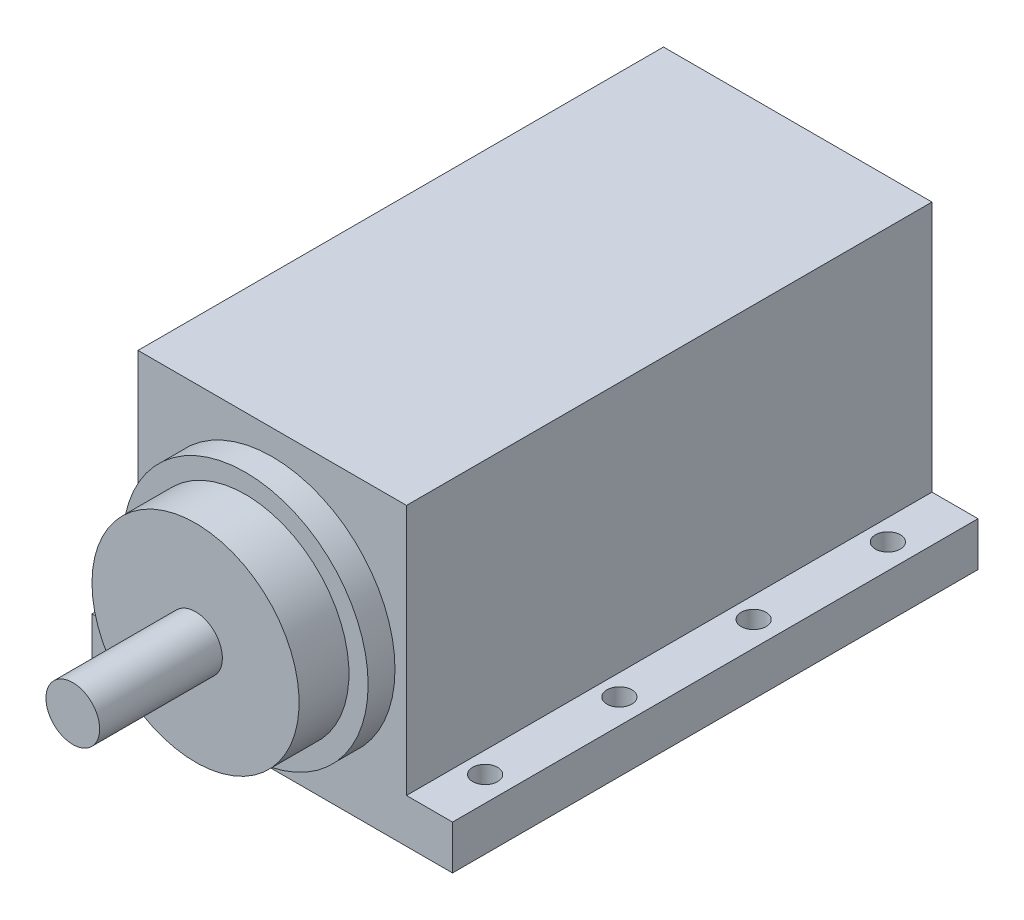
ISO-10303-21;
HEADER;
FILE_DESCRIPTION(('STEP AP214'),'2;1');
FILE_NAME('part.step','',(''),(''),'','','');
FILE_SCHEMA(('AUTOMOTIVE_DESIGN { 1 0 10303 214 1 1 1 1 }'));
ENDSEC;
DATA;
#1=APPLICATION_CONTEXT('core data for automotive mechanical design processes');
#2=APPLICATION_PROTOCOL_DEFINITION('international standard','automotive_design',2000,#1);
#3=PRODUCT_CONTEXT('',#1,'mechanical');
#4=PRODUCT('Part','Part','',(#3));
#5=PRODUCT_RELATED_PRODUCT_CATEGORY('part','',(#4));
#6=PRODUCT_DEFINITION_FORMATION('','',#4);
#7=PRODUCT_DEFINITION_CONTEXT('part definition',#1,'design');
#8=PRODUCT_DEFINITION('design','',#6,#7);
#9=PRODUCT_DEFINITION_SHAPE('','',#8);
#10=(LENGTH_UNIT() NAMED_UNIT(*) SI_UNIT(.MILLI.,.METRE.));
#11=(NAMED_UNIT(*) PLANE_ANGLE_UNIT() SI_UNIT($,.RADIAN.));
#12=(NAMED_UNIT(*) SI_UNIT($,.STERADIAN.) SOLID_ANGLE_UNIT());
#13=UNCERTAINTY_MEASURE_WITH_UNIT(LENGTH_MEASURE(1.E-05),#10,'distance_accuracy_value','');
#14=(GEOMETRIC_REPRESENTATION_CONTEXT(3) GLOBAL_UNCERTAINTY_ASSIGNED_CONTEXT((#13)) GLOBAL_UNIT_ASSIGNED_CONTEXT((#10,
#11,#12)) REPRESENTATION_CONTEXT('',''));
#15=CARTESIAN_POINT('',(0.,0.,0.));
#16=DIRECTION('',(0.,0.,1.));
#17=DIRECTION('',(1.,0.,0.));
#18=AXIS2_PLACEMENT_3D('',#15,#16,#17);
#19=CARTESIAN_POINT('',(47.,0.,137.));
#20=DIRECTION('',(-1.,0.,0.));
#21=DIRECTION('',(0.,-1.,0.));
#22=AXIS2_PLACEMENT_3D('',#19,#20,#21);
#23=PLANE('',#22);
#24=DIRECTION('',(0.,1.,0.));
#25=VECTOR('',#24,1.);
#26=CARTESIAN_POINT('',(47.,0.,0.));
#27=LINE('',#26,#25);
#28=CARTESIAN_POINT('',(47.,0.,0.));
#29=VERTEX_POINT('',#28);
#30=CARTESIAN_POINT('',(47.,11.5,0.));
#31=VERTEX_POINT('',#30);
#32=EDGE_CURVE('E129',#29,#31,#27,.T.);
#33=ORIENTED_EDGE('',*,*,#32,.T.);
#34=DIRECTION('',(0.,0.,-1.));
#35=VECTOR('',#34,1.);
#36=CARTESIAN_POINT('',(47.,11.5,137.));
#37=LINE('',#36,#35);
#38=CARTESIAN_POINT('',(47.,11.5,137.));
#39=VERTEX_POINT('',#38);
#40=EDGE_CURVE('E11',#39,#31,#37,.T.);
#41=ORIENTED_EDGE('',*,*,#40,.F.);
#42=DIRECTION('',(0.,1.,0.));
#43=VECTOR('',#42,1.);
#44=CARTESIAN_POINT('',(47.,0.,137.));
#45=LINE('',#44,#43);
#46=CARTESIAN_POINT('',(47.,0.,137.));
#47=VERTEX_POINT('',#46);
#48=EDGE_CURVE('E144',#47,#39,#45,.T.);
#49=ORIENTED_EDGE('',*,*,#48,.F.);
#50=DIRECTION('',(0.,0.,-1.));
#51=VECTOR('',#50,1.);
#52=CARTESIAN_POINT('',(47.,0.,137.));
#53=LINE('',#52,#51);
#54=EDGE_CURVE('E125',#47,#29,#53,.T.);
#55=ORIENTED_EDGE('',*,*,#54,.T.);
#56=EDGE_LOOP('',(#33,#41,#49,#55));
#57=FACE_BOUND('',#56,.T.);
#58=ADVANCED_FACE('F33',(#57),#23,.F.);
#59=CARTESIAN_POINT('',(47.,11.5,137.));
#60=DIRECTION('',(0.,-1.,0.));
#61=DIRECTION('',(1.,0.,0.));
#62=AXIS2_PLACEMENT_3D('',#59,#60,#61);
#63=PLANE('',#62);
#64=CARTESIAN_POINT('',(40.4999999999999,11.5,87.));
#65=DIRECTION('',(0.,-1.,0.));
#66=DIRECTION('',(1.,0.,0.));
#67=AXIS2_PLACEMENT_3D('',#64,#65,#66);
#68=CIRCLE('',#67,3.25);
#69=CARTESIAN_POINT('',(43.7499999999999,11.5,87.));
#70=VERTEX_POINT('',#69);
#71=EDGE_CURVE('E200',#70,#70,#68,.T.);
#72=ORIENTED_EDGE('',*,*,#71,.T.);
#73=EDGE_LOOP('',(#72));
#74=FACE_BOUND('',#73,.T.);
#75=CARTESIAN_POINT('',(40.4999999999998,11.5,52.));
#76=DIRECTION('',(0.,-1.,0.));
#77=DIRECTION('',(1.,0.,0.));
#78=AXIS2_PLACEMENT_3D('',#75,#76,#77);
#79=CIRCLE('',#78,3.25);
#80=CARTESIAN_POINT('',(43.7499999999998,11.5,52.));
#81=VERTEX_POINT('',#80);
#82=EDGE_CURVE('E203',#81,#81,#79,.T.);
#83=ORIENTED_EDGE('',*,*,#82,.T.);
#84=EDGE_LOOP('',(#83));
#85=FACE_BOUND('',#84,.T.);
#86=CARTESIAN_POINT('',(40.4999999999996,11.5,17.));
#87=DIRECTION('',(0.,-1.,0.));
#88=DIRECTION('',(1.,0.,0.));
#89=AXIS2_PLACEMENT_3D('',#86,#87,#88);
#90=CIRCLE('',#89,3.25);
#91=CARTESIAN_POINT('',(43.7499999999997,11.5,17.));
#92=VERTEX_POINT('',#91);
#93=EDGE_CURVE('E206',#92,#92,#90,.T.);
#94=ORIENTED_EDGE('',*,*,#93,.T.);
#95=EDGE_LOOP('',(#94));
#96=FACE_BOUND('',#95,.T.);
#97=CARTESIAN_POINT('',(40.5,11.5,122.));
#98=DIRECTION('',(0.,-1.,0.));
#99=DIRECTION('',(1.,0.,0.));
#100=AXIS2_PLACEMENT_3D('',#97,#98,#99);
#101=CIRCLE('',#100,3.25);
#102=CARTESIAN_POINT('',(43.75,11.5,122.));
#103=VERTEX_POINT('',#102);
#104=EDGE_CURVE('E192',#103,#103,#101,.T.);
#105=ORIENTED_EDGE('',*,*,#104,.T.);
#106=EDGE_LOOP('',(#105));
#107=FACE_BOUND('',#106,.T.);
#108=DIRECTION('',(-1.,0.,0.));
#109=VECTOR('',#108,1.);
#110=CARTESIAN_POINT('',(47.,11.5,0.));
#111=LINE('',#110,#109);
#112=CARTESIAN_POINT('',(35.,11.5,0.));
#113=VERTEX_POINT('',#112);
#114=EDGE_CURVE('E132',#31,#113,#111,.T.);
#115=ORIENTED_EDGE('',*,*,#114,.T.);
#116=DIRECTION('',(0.,0.,-1.));
#117=VECTOR('',#116,1.);
#118=CARTESIAN_POINT('',(35.,11.5,137.));
#119=LINE('',#118,#117);
#120=CARTESIAN_POINT('',(35.,11.5,137.));
#121=VERTEX_POINT('',#120);
#122=EDGE_CURVE('E41',#121,#113,#119,.T.);
#123=ORIENTED_EDGE('',*,*,#122,.F.);
#124=DIRECTION('',(-1.,0.,0.));
#125=VECTOR('',#124,1.);
#126=CARTESIAN_POINT('',(47.,11.5,137.));
#127=LINE('',#126,#125);
#128=EDGE_CURVE('E92',#39,#121,#127,.T.);
#129=ORIENTED_EDGE('',*,*,#128,.F.);
#130=ORIENTED_EDGE('',*,*,#40,.T.);
#131=EDGE_LOOP('',(#115,#123,#129,#130));
#132=FACE_BOUND('',#131,.T.);
#133=ADVANCED_FACE('F253',(#74,#85,#96,#107,#132),#63,.F.);
#134=CARTESIAN_POINT('',(35.,11.5,137.));
#135=DIRECTION('',(-1.,0.,0.));
#136=DIRECTION('',(0.,-1.,0.));
#137=AXIS2_PLACEMENT_3D('',#134,#135,#136);
#138=PLANE('',#137);
#139=DIRECTION('',(0.,1.,0.));
#140=VECTOR('',#139,1.);
#141=CARTESIAN_POINT('',(35.,11.5,0.));
#142=LINE('',#141,#140);
#143=CARTESIAN_POINT('',(35.,77.,0.));
#144=VERTEX_POINT('',#143);
#145=EDGE_CURVE('E135',#113,#144,#142,.T.);
#146=ORIENTED_EDGE('',*,*,#145,.T.);
#147=DIRECTION('',(0.,0.,-1.));
#148=VECTOR('',#147,1.);
#149=CARTESIAN_POINT('',(35.,77.,137.));
#150=LINE('',#149,#148);
#151=CARTESIAN_POINT('',(35.,77.,137.));
#152=VERTEX_POINT('',#151);
#153=EDGE_CURVE('E151',#152,#144,#150,.T.);
#154=ORIENTED_EDGE('',*,*,#153,.F.);
#155=DIRECTION('',(0.,1.,0.));
#156=VECTOR('',#155,1.);
#157=CARTESIAN_POINT('',(35.,11.5,137.));
#158=LINE('',#157,#156);
#159=EDGE_CURVE('E159',#121,#152,#158,.T.);
#160=ORIENTED_EDGE('',*,*,#159,.F.);
#161=ORIENTED_EDGE('',*,*,#122,.T.);
#162=EDGE_LOOP('',(#146,#154,#160,#161));
#163=FACE_BOUND('',#162,.T.);
#164=ADVANCED_FACE('F157',(#163),#138,.F.);
#165=CARTESIAN_POINT('',(35.,77.,137.));
#166=DIRECTION('',(0.,-1.,0.));
#167=DIRECTION('',(1.,0.,0.));
#168=AXIS2_PLACEMENT_3D('',#165,#166,#167);
#169=PLANE('',#168);
#170=DIRECTION('',(-1.,0.,0.));
#171=VECTOR('',#170,1.);
#172=CARTESIAN_POINT('',(35.,77.,0.));
#173=LINE('',#172,#171);
#174=CARTESIAN_POINT('',(-35.,77.,0.));
#175=VERTEX_POINT('',#174);
#176=EDGE_CURVE('E137',#144,#175,#173,.T.);
#177=ORIENTED_EDGE('',*,*,#176,.T.);
#178=DIRECTION('',(0.,0.,-1.));
#179=VECTOR('',#178,1.);
#180=CARTESIAN_POINT('',(-35.,77.,137.));
#181=LINE('',#180,#179);
#182=CARTESIAN_POINT('',(-35.,77.,137.));
#183=VERTEX_POINT('',#182);
#184=EDGE_CURVE('E148',#183,#175,#181,.T.);
#185=ORIENTED_EDGE('',*,*,#184,.F.);
#186=DIRECTION('',(-1.,0.,0.));
#187=VECTOR('',#186,1.);
#188=CARTESIAN_POINT('',(35.,77.,137.));
#189=LINE('',#188,#187);
#190=EDGE_CURVE('E171',#152,#183,#189,.T.);
#191=ORIENTED_EDGE('',*,*,#190,.F.);
#192=ORIENTED_EDGE('',*,*,#153,.T.);
#193=EDGE_LOOP('',(#177,#185,#191,#192));
#194=FACE_BOUND('',#193,.T.);
#195=ADVANCED_FACE('F167',(#194),#169,.F.);
#196=CARTESIAN_POINT('',(-35.,11.5,137.));
#197=DIRECTION('',(1.,0.,0.));
#198=DIRECTION('',(0.,1.,0.));
#199=AXIS2_PLACEMENT_3D('',#196,#197,#198);
#200=PLANE('',#199);
#201=DIRECTION('',(0.,-1.,0.));
#202=VECTOR('',#201,1.);
#203=CARTESIAN_POINT('',(-35.,11.5,0.));
#204=LINE('',#203,#202);
#205=CARTESIAN_POINT('',(-35.,11.5,0.));
#206=VERTEX_POINT('',#205);
#207=EDGE_CURVE('E139',#175,#206,#204,.T.);
#208=ORIENTED_EDGE('',*,*,#207,.T.);
#209=DIRECTION('',(0.,0.,-1.));
#210=VECTOR('',#209,1.);
#211=CARTESIAN_POINT('',(-35.,11.5,137.));
#212=LINE('',#211,#210);
#213=CARTESIAN_POINT('',(-35.,11.5,137.));
#214=VERTEX_POINT('',#213);
#215=EDGE_CURVE('E120',#214,#206,#212,.T.);
#216=ORIENTED_EDGE('',*,*,#215,.F.);
#217=DIRECTION('',(0.,-1.,0.));
#218=VECTOR('',#217,1.);
#219=CARTESIAN_POINT('',(-35.,11.5,137.));
#220=LINE('',#219,#218);
#221=EDGE_CURVE('E111',#183,#214,#220,.T.);
#222=ORIENTED_EDGE('',*,*,#221,.F.);
#223=ORIENTED_EDGE('',*,*,#184,.T.);
#224=EDGE_LOOP('',(#208,#216,#222,#223));
#225=FACE_BOUND('',#224,.T.);
#226=ADVANCED_FACE('F170',(#225),#200,.F.);
#227=CARTESIAN_POINT('',(-47.,11.5,137.));
#228=DIRECTION('',(0.,-1.,0.));
#229=DIRECTION('',(0.,0.,-1.));
#230=AXIS2_PLACEMENT_3D('',#227,#228,#229);
#231=PLANE('',#230);
#232=CARTESIAN_POINT('',(-40.4999999999996,11.5,17.));
#233=DIRECTION('',(0.,-1.,0.));
#234=DIRECTION('',(0.,0.,-1.));
#235=AXIS2_PLACEMENT_3D('',#232,#233,#234);
#236=CIRCLE('',#235,3.25);
#237=CARTESIAN_POINT('',(-40.4999999999996,11.5,13.75));
#238=VERTEX_POINT('',#237);
#239=EDGE_CURVE('E209',#238,#238,#236,.T.);
#240=ORIENTED_EDGE('',*,*,#239,.T.);
#241=EDGE_LOOP('',(#240));
#242=FACE_BOUND('',#241,.T.);
#243=CARTESIAN_POINT('',(-40.4999999999998,11.5,52.));
#244=DIRECTION('',(0.,-1.,0.));
#245=DIRECTION('',(0.,0.,-1.));
#246=AXIS2_PLACEMENT_3D('',#243,#244,#245);
#247=CIRCLE('',#246,3.25);
#248=CARTESIAN_POINT('',(-40.4999999999998,11.5,48.75));
#249=VERTEX_POINT('',#248);
#250=EDGE_CURVE('E212',#249,#249,#247,.T.);
#251=ORIENTED_EDGE('',*,*,#250,.T.);
#252=EDGE_LOOP('',(#251));
#253=FACE_BOUND('',#252,.T.);
#254=CARTESIAN_POINT('',(-40.4999999999999,11.5,87.));
#255=DIRECTION('',(0.,-1.,0.));
#256=DIRECTION('',(0.,0.,-1.));
#257=AXIS2_PLACEMENT_3D('',#254,#255,#256);
#258=CIRCLE('',#257,3.25);
#259=CARTESIAN_POINT('',(-40.4999999999999,11.5,83.75));
#260=VERTEX_POINT('',#259);
#261=EDGE_CURVE('E215',#260,#260,#258,.T.);
#262=ORIENTED_EDGE('',*,*,#261,.T.);
#263=EDGE_LOOP('',(#262));
#264=FACE_BOUND('',#263,.T.);
#265=CARTESIAN_POINT('',(-40.5,11.5,122.));
#266=DIRECTION('',(0.,-1.,0.));
#267=DIRECTION('',(0.,0.,-1.));
#268=AXIS2_PLACEMENT_3D('',#265,#266,#267);
#269=CIRCLE('',#268,3.25);
#270=CARTESIAN_POINT('',(-40.5,11.5,118.75));
#271=VERTEX_POINT('',#270);
#272=EDGE_CURVE('E218',#271,#271,#269,.T.);
#273=ORIENTED_EDGE('',*,*,#272,.T.);
#274=EDGE_LOOP('',(#273));
#275=FACE_BOUND('',#274,.T.);
#276=DIRECTION('',(-1.,0.,0.));
#277=VECTOR('',#276,1.);
#278=CARTESIAN_POINT('',(-47.,11.5,0.));
#279=LINE('',#278,#277);
#280=CARTESIAN_POINT('',(-47.,11.5,0.));
#281=VERTEX_POINT('',#280);
#282=EDGE_CURVE('E119',#206,#281,#279,.T.);
#283=ORIENTED_EDGE('',*,*,#282,.T.);
#284=DIRECTION('',(0.,0.,-1.));
#285=VECTOR('',#284,1.);
#286=CARTESIAN_POINT('',(-47.,11.5,137.));
#287=LINE('',#286,#285);
#288=CARTESIAN_POINT('',(-47.,11.5,137.));
#289=VERTEX_POINT('',#288);
#290=EDGE_CURVE('E116',#289,#281,#287,.T.);
#291=ORIENTED_EDGE('',*,*,#290,.F.);
#292=DIRECTION('',(-1.,0.,0.));
#293=VECTOR('',#292,1.);
#294=CARTESIAN_POINT('',(-47.,11.5,137.));
#295=LINE('',#294,#293);
#296=EDGE_CURVE('E105',#214,#289,#295,.T.);
#297=ORIENTED_EDGE('',*,*,#296,.F.);
#298=ORIENTED_EDGE('',*,*,#215,.T.);
#299=EDGE_LOOP('',(#283,#291,#297,#298));
#300=FACE_BOUND('',#299,.T.);
#301=ADVANCED_FACE('F117',(#242,#253,#264,#275,#300),#231,.F.);
#302=CARTESIAN_POINT('',(-47.,0.,137.));
#303=DIRECTION('',(1.,0.,0.));
#304=DIRECTION('',(0.,1.,0.));
#305=AXIS2_PLACEMENT_3D('',#302,#303,#304);
#306=PLANE('',#305);
#307=DIRECTION('',(0.,-1.,0.));
#308=VECTOR('',#307,1.);
#309=CARTESIAN_POINT('',(-47.,0.,0.));
#310=LINE('',#309,#308);
#311=CARTESIAN_POINT('',(-47.,0.,0.));
#312=VERTEX_POINT('',#311);
#313=EDGE_CURVE('E78',#281,#312,#310,.T.);
#314=ORIENTED_EDGE('',*,*,#313,.T.);
#315=DIRECTION('',(0.,0.,-1.));
#316=VECTOR('',#315,1.);
#317=CARTESIAN_POINT('',(-47.,0.,137.));
#318=LINE('',#317,#316);
#319=CARTESIAN_POINT('',(-47.,0.,137.));
#320=VERTEX_POINT('',#319);
#321=EDGE_CURVE('E121',#320,#312,#318,.T.);
#322=ORIENTED_EDGE('',*,*,#321,.F.);
#323=DIRECTION('',(0.,-1.,0.));
#324=VECTOR('',#323,1.);
#325=CARTESIAN_POINT('',(-47.,0.,137.));
#326=LINE('',#325,#324);
#327=EDGE_CURVE('E109',#289,#320,#326,.T.);
#328=ORIENTED_EDGE('',*,*,#327,.F.);
#329=ORIENTED_EDGE('',*,*,#290,.T.);
#330=EDGE_LOOP('',(#314,#322,#328,#329));
#331=FACE_BOUND('',#330,.T.);
#332=ADVANCED_FACE('F123',(#331),#306,.F.);
#333=CARTESIAN_POINT('',(-47.,0.,137.));
#334=DIRECTION('',(0.,1.,0.));
#335=DIRECTION('',(-1.,0.,0.));
#336=AXIS2_PLACEMENT_3D('',#333,#334,#335);
#337=PLANE('',#336);
#338=CARTESIAN_POINT('',(40.4999999999999,0.,87.));
#339=DIRECTION('',(0.,1.,0.));
#340=DIRECTION('',(0.,0.,1.));
#341=AXIS2_PLACEMENT_3D('',#338,#339,#340);
#342=CIRCLE('',#341,3.25);
#343=CARTESIAN_POINT('',(40.4999999999999,0.,90.25));
#344=VERTEX_POINT('',#343);
#345=EDGE_CURVE('E221',#344,#344,#342,.T.);
#346=ORIENTED_EDGE('',*,*,#345,.T.);
#347=EDGE_LOOP('',(#346));
#348=FACE_BOUND('',#347,.T.);
#349=CARTESIAN_POINT('',(40.4999999999998,0.,52.));
#350=DIRECTION('',(0.,1.,0.));
#351=DIRECTION('',(0.,0.,1.));
#352=AXIS2_PLACEMENT_3D('',#349,#350,#351);
#353=CIRCLE('',#352,3.25);
#354=CARTESIAN_POINT('',(40.4999999999998,0.,55.25));
#355=VERTEX_POINT('',#354);
#356=EDGE_CURVE('E237',#355,#355,#353,.T.);
#357=ORIENTED_EDGE('',*,*,#356,.T.);
#358=EDGE_LOOP('',(#357));
#359=FACE_BOUND('',#358,.T.);
#360=CARTESIAN_POINT('',(40.4999999999996,0.,17.));
#361=DIRECTION('',(0.,1.,0.));
#362=DIRECTION('',(0.,0.,1.));
#363=AXIS2_PLACEMENT_3D('',#360,#361,#362);
#364=CIRCLE('',#363,3.25);
#365=CARTESIAN_POINT('',(40.4999999999996,0.,20.25));
#366=VERTEX_POINT('',#365);
#367=EDGE_CURVE('E234',#366,#366,#364,.T.);
#368=ORIENTED_EDGE('',*,*,#367,.T.);
#369=EDGE_LOOP('',(#368));
#370=FACE_BOUND('',#369,.T.);
#371=CARTESIAN_POINT('',(-40.4999999999996,0.,17.));
#372=DIRECTION('',(0.,1.,0.));
#373=DIRECTION('',(0.,0.,-1.));
#374=AXIS2_PLACEMENT_3D('',#371,#372,#373);
#375=CIRCLE('',#374,3.25);
#376=CARTESIAN_POINT('',(-40.4999999999996,0.,13.75));
#377=VERTEX_POINT('',#376);
#378=EDGE_CURVE('E231',#377,#377,#375,.T.);
#379=ORIENTED_EDGE('',*,*,#378,.T.);
#380=EDGE_LOOP('',(#379));
#381=FACE_BOUND('',#380,.T.);
#382=CARTESIAN_POINT('',(-40.4999999999998,0.,52.));
#383=DIRECTION('',(0.,1.,0.));
#384=DIRECTION('',(0.,0.,-1.));
#385=AXIS2_PLACEMENT_3D('',#382,#383,#384);
#386=CIRCLE('',#385,3.25);
#387=CARTESIAN_POINT('',(-40.4999999999998,0.,48.75));
#388=VERTEX_POINT('',#387);
#389=EDGE_CURVE('E228',#388,#388,#386,.T.);
#390=ORIENTED_EDGE('',*,*,#389,.T.);
#391=EDGE_LOOP('',(#390));
#392=FACE_BOUND('',#391,.T.);
#393=CARTESIAN_POINT('',(-40.4999999999999,0.,87.));
#394=DIRECTION('',(0.,1.,0.));
#395=DIRECTION('',(0.,0.,-1.));
#396=AXIS2_PLACEMENT_3D('',#393,#394,#395);
#397=CIRCLE('',#396,3.25);
#398=CARTESIAN_POINT('',(-40.4999999999999,0.,83.75));
#399=VERTEX_POINT('',#398);
#400=EDGE_CURVE('E225',#399,#399,#397,.T.);
#401=ORIENTED_EDGE('',*,*,#400,.T.);
#402=EDGE_LOOP('',(#401));
#403=FACE_BOUND('',#402,.T.);
#404=CARTESIAN_POINT('',(-40.5,0.,122.));
#405=DIRECTION('',(0.,1.,0.));
#406=DIRECTION('',(0.,0.,-1.));
#407=AXIS2_PLACEMENT_3D('',#404,#405,#406);
#408=CIRCLE('',#407,3.25);
#409=CARTESIAN_POINT('',(-40.5,0.,118.75));
#410=VERTEX_POINT('',#409);
#411=EDGE_CURVE('E222',#410,#410,#408,.T.);
#412=ORIENTED_EDGE('',*,*,#411,.T.);
#413=EDGE_LOOP('',(#412));
#414=FACE_BOUND('',#413,.T.);
#415=CARTESIAN_POINT('',(40.5,0.,122.));
#416=DIRECTION('',(0.,1.,0.));
#417=DIRECTION('',(0.,0.,1.));
#418=AXIS2_PLACEMENT_3D('',#415,#416,#417);
#419=CIRCLE('',#418,3.25);
#420=CARTESIAN_POINT('',(40.5,0.,125.25));
#421=VERTEX_POINT('',#420);
#422=EDGE_CURVE('E197',#421,#421,#419,.T.);
#423=ORIENTED_EDGE('',*,*,#422,.T.);
#424=EDGE_LOOP('',(#423));
#425=FACE_BOUND('',#424,.T.);
#426=DIRECTION('',(1.,0.,0.));
#427=VECTOR('',#426,1.);
#428=CARTESIAN_POINT('',(-47.,0.,0.));
#429=LINE('',#428,#427);
#430=EDGE_CURVE('E84',#312,#29,#429,.T.);
#431=ORIENTED_EDGE('',*,*,#430,.T.);
#432=ORIENTED_EDGE('',*,*,#54,.F.);
#433=DIRECTION('',(1.,0.,0.));
#434=VECTOR('',#433,1.);
#435=CARTESIAN_POINT('',(-47.,0.,137.));
#436=LINE('',#435,#434);
#437=EDGE_CURVE('E49',#320,#47,#436,.T.);
#438=ORIENTED_EDGE('',*,*,#437,.F.);
#439=ORIENTED_EDGE('',*,*,#321,.T.);
#440=EDGE_LOOP('',(#431,#432,#438,#439));
#441=FACE_BOUND('',#440,.T.);
#442=ADVANCED_FACE('F243',(#348,#359,#370,#381,#392,#403,#414,#425,#441),#337,.F.);
#443=CARTESIAN_POINT('',(0.,0.,137.));
#444=DIRECTION('',(0.,0.,1.));
#445=DIRECTION('',(1.,0.,0.));
#446=AXIS2_PLACEMENT_3D('',#443,#444,#445);
#447=PLANE('',#446);
#448=CARTESIAN_POINT('',(0.,38.5,137.));
#449=DIRECTION('',(0.,0.,1.));
#450=DIRECTION('',(1.,0.,0.));
#451=AXIS2_PLACEMENT_3D('',#448,#449,#450);
#452=CIRCLE('',#451,32.);
#453=CARTESIAN_POINT('',(32.,38.5,137.));
#454=VERTEX_POINT('',#453);
#455=EDGE_CURVE('E177',#454,#454,#452,.T.);
#456=ORIENTED_EDGE('',*,*,#455,.F.);
#457=EDGE_LOOP('',(#456));
#458=FACE_BOUND('',#457,.T.);
#459=ORIENTED_EDGE('',*,*,#48,.T.);
#460=ORIENTED_EDGE('',*,*,#128,.T.);
#461=ORIENTED_EDGE('',*,*,#159,.T.);
#462=ORIENTED_EDGE('',*,*,#190,.T.);
#463=ORIENTED_EDGE('',*,*,#221,.T.);
#464=ORIENTED_EDGE('',*,*,#296,.T.);
#465=ORIENTED_EDGE('',*,*,#327,.T.);
#466=ORIENTED_EDGE('',*,*,#437,.T.);
#467=EDGE_LOOP('',(#459,#460,#461,#462,#463,#464,#465,#466));
#468=FACE_BOUND('',#467,.T.);
#469=ADVANCED_FACE('F107',(#458,#468),#447,.T.);
#470=CARTESIAN_POINT('',(0.,0.,0.));
#471=DIRECTION('',(0.,0.,1.));
#472=DIRECTION('',(1.,0.,0.));
#473=AXIS2_PLACEMENT_3D('',#470,#471,#472);
#474=PLANE('',#473);
#475=ORIENTED_EDGE('',*,*,#32,.F.);
#476=ORIENTED_EDGE('',*,*,#430,.F.);
#477=ORIENTED_EDGE('',*,*,#313,.F.);
#478=ORIENTED_EDGE('',*,*,#282,.F.);
#479=ORIENTED_EDGE('',*,*,#207,.F.);
#480=ORIENTED_EDGE('',*,*,#176,.F.);
#481=ORIENTED_EDGE('',*,*,#145,.F.);
#482=ORIENTED_EDGE('',*,*,#114,.F.);
#483=EDGE_LOOP('',(#475,#476,#477,#478,#479,#480,#481,#482));
#484=FACE_BOUND('',#483,.T.);
#485=ADVANCED_FACE('F163',(#484),#474,.F.);
#486=CARTESIAN_POINT('',(0.,38.5,144.));
#487=DIRECTION('',(0.,0.,-1.));
#488=DIRECTION('',(-1.,0.,0.));
#489=AXIS2_PLACEMENT_3D('',#486,#487,#488);
#490=CYLINDRICAL_SURFACE('',#489,32.);
#491=CARTESIAN_POINT('',(0.,38.5,144.));
#492=DIRECTION('',(0.,0.,1.));
#493=DIRECTION('',(1.,0.,0.));
#494=AXIS2_PLACEMENT_3D('',#491,#492,#493);
#495=CIRCLE('',#494,32.);
#496=CARTESIAN_POINT('',(32.,38.5,144.));
#497=VERTEX_POINT('',#496);
#498=EDGE_CURVE('E133',#497,#497,#495,.T.);
#499=ORIENTED_EDGE('',*,*,#498,.F.);
#500=EDGE_LOOP('',(#499));
#501=FACE_BOUND('',#500,.T.);
#502=ORIENTED_EDGE('',*,*,#455,.T.);
#503=EDGE_LOOP('',(#502));
#504=FACE_BOUND('',#503,.T.);
#505=ADVANCED_FACE('F321',(#501,#504),#490,.T.);
#506=CARTESIAN_POINT('',(0.,38.5,144.));
#507=DIRECTION('',(0.,0.,1.));
#508=DIRECTION('',(1.,0.,0.));
#509=AXIS2_PLACEMENT_3D('',#506,#507,#508);
#510=PLANE('',#509);
#511=CARTESIAN_POINT('',(0.,38.5,144.));
#512=DIRECTION('',(0.,0.,1.));
#513=DIRECTION('',(1.,0.,0.));
#514=AXIS2_PLACEMENT_3D('',#511,#512,#513);
#515=CIRCLE('',#514,27.);
#516=CARTESIAN_POINT('',(-27.,38.5,144.));
#517=VERTEX_POINT('',#516);
#518=EDGE_CURVE('E183',#517,#517,#515,.T.);
#519=ORIENTED_EDGE('',*,*,#518,.F.);
#520=EDGE_LOOP('',(#519));
#521=FACE_BOUND('',#520,.T.);
#522=ORIENTED_EDGE('',*,*,#498,.T.);
#523=EDGE_LOOP('',(#522));
#524=FACE_BOUND('',#523,.T.);
#525=ADVANCED_FACE('F335',(#521,#524),#510,.T.);
#526=CARTESIAN_POINT('',(0.,38.5,157.));
#527=DIRECTION('',(0.,0.,-1.));
#528=DIRECTION('',(-1.,0.,0.));
#529=AXIS2_PLACEMENT_3D('',#526,#527,#528);
#530=CYLINDRICAL_SURFACE('',#529,27.);
#531=CARTESIAN_POINT('',(0.,38.5,157.));
#532=DIRECTION('',(0.,0.,1.));
#533=DIRECTION('',(1.,0.,0.));
#534=AXIS2_PLACEMENT_3D('',#531,#532,#533);
#535=CIRCLE('',#534,27.);
#536=CARTESIAN_POINT('',(-27.,38.5,157.));
#537=VERTEX_POINT('',#536);
#538=EDGE_CURVE('E180',#537,#537,#535,.T.);
#539=CARTESIAN_POINT('',(-27.,38.5,157.));
#540=CARTESIAN_POINT('',(-27.,38.5,156.864583333333));
#541=CARTESIAN_POINT('',(-27.,38.5,156.729166666667));
#542=CARTESIAN_POINT('',(-27.,38.5,156.458333333333));
#543=CARTESIAN_POINT('',(-27.,38.5,156.322916666667));
#544=CARTESIAN_POINT('',(-27.,38.5,156.052083333333));
#545=CARTESIAN_POINT('',(-27.,38.5,155.916666666667));
#546=CARTESIAN_POINT('',(-27.,38.5,155.645833333333));
#547=CARTESIAN_POINT('',(-27.,38.5,155.510416666667));
#548=CARTESIAN_POINT('',(-27.,38.5,155.239583333333));
#549=CARTESIAN_POINT('',(-27.,38.5,155.104166666667));
#550=CARTESIAN_POINT('',(-27.,38.5,154.833333333333));
#551=CARTESIAN_POINT('',(-27.,38.5,154.697916666667));
#552=CARTESIAN_POINT('',(-27.,38.5,154.427083333333));
#553=CARTESIAN_POINT('',(-27.,38.5,154.291666666667));
#554=CARTESIAN_POINT('',(-27.,38.5,154.020833333333));
#555=CARTESIAN_POINT('',(-27.,38.5,153.885416666667));
#556=CARTESIAN_POINT('',(-27.,38.5,153.614583333333));
#557=CARTESIAN_POINT('',(-27.,38.5,153.479166666667));
#558=CARTESIAN_POINT('',(-27.,38.5,153.208333333333));
#559=CARTESIAN_POINT('',(-27.,38.5,153.072916666667));
#560=CARTESIAN_POINT('',(-27.,38.5,152.802083333333));
#561=CARTESIAN_POINT('',(-27.,38.5,152.666666666667));
#562=CARTESIAN_POINT('',(-27.,38.5,152.395833333333));
#563=CARTESIAN_POINT('',(-27.,38.5,152.260416666667));
#564=CARTESIAN_POINT('',(-27.,38.5,151.989583333333));
#565=CARTESIAN_POINT('',(-27.,38.5,151.854166666667));
#566=CARTESIAN_POINT('',(-27.,38.5,151.583333333333));
#567=CARTESIAN_POINT('',(-27.,38.5,151.447916666667));
#568=CARTESIAN_POINT('',(-27.,38.5,151.177083333333));
#569=CARTESIAN_POINT('',(-27.,38.5,151.041666666667));
#570=CARTESIAN_POINT('',(-27.,38.5,150.770833333333));
#571=CARTESIAN_POINT('',(-27.,38.5,150.635416666667));
#572=CARTESIAN_POINT('',(-27.,38.5,150.364583333333));
#573=CARTESIAN_POINT('',(-27.,38.5,150.229166666667));
#574=CARTESIAN_POINT('',(-27.,38.5,149.958333333333));
#575=CARTESIAN_POINT('',(-27.,38.5,149.822916666667));
#576=CARTESIAN_POINT('',(-27.,38.5,149.552083333333));
#577=CARTESIAN_POINT('',(-27.,38.5,149.416666666667));
#578=CARTESIAN_POINT('',(-27.,38.5,149.145833333333));
#579=CARTESIAN_POINT('',(-27.,38.5,149.010416666667));
#580=CARTESIAN_POINT('',(-27.,38.5,148.739583333333));
#581=CARTESIAN_POINT('',(-27.,38.5,148.604166666667));
#582=CARTESIAN_POINT('',(-27.,38.5,148.333333333333));
#583=CARTESIAN_POINT('',(-27.,38.5,148.197916666667));
#584=CARTESIAN_POINT('',(-27.,38.5,147.927083333333));
#585=CARTESIAN_POINT('',(-27.,38.5,147.791666666667));
#586=CARTESIAN_POINT('',(-27.,38.5,147.520833333333));
#587=CARTESIAN_POINT('',(-27.,38.5,147.385416666667));
#588=CARTESIAN_POINT('',(-27.,38.5,147.114583333333));
#589=CARTESIAN_POINT('',(-27.,38.5,146.979166666667));
#590=CARTESIAN_POINT('',(-27.,38.5,146.708333333333));
#591=CARTESIAN_POINT('',(-27.,38.5,146.572916666667));
#592=CARTESIAN_POINT('',(-27.,38.5,146.302083333333));
#593=CARTESIAN_POINT('',(-27.,38.5,146.166666666667));
#594=CARTESIAN_POINT('',(-27.,38.5,145.895833333333));
#595=CARTESIAN_POINT('',(-27.,38.5,145.760416666667));
#596=CARTESIAN_POINT('',(-27.,38.5,145.489583333333));
#597=CARTESIAN_POINT('',(-27.,38.5,145.354166666667));
#598=CARTESIAN_POINT('',(-27.,38.5,145.083333333333));
#599=CARTESIAN_POINT('',(-27.,38.5,144.947916666667));
#600=CARTESIAN_POINT('',(-27.,38.5,144.677083333333));
#601=CARTESIAN_POINT('',(-27.,38.5,144.541666666667));
#602=CARTESIAN_POINT('',(-27.,38.5,144.270833333333));
#603=CARTESIAN_POINT('',(-27.,38.5,144.135416666667));
#604=CARTESIAN_POINT('',(-27.,38.5,144.));
#605=B_SPLINE_CURVE_WITH_KNOTS('',3,(#539,#540,#541,#542,#543,#544,#545,#546,#547,#548,#549,
#550,#551,#552,#553,#554,#555,#556,#557,#558,#559,#560,#561,#562,#563,#564,#565,#566,#567,#568,
#569,#570,#571,#572,#573,#574,#575,#576,#577,#578,#579,#580,#581,#582,#583,#584,#585,#586,#587,
#588,#589,#590,#591,#592,#593,#594,#595,#596,#597,#598,#599,#600,#601,#602,#603,#604),
.UNSPECIFIED.,.F.,.F.,(4,2,2,2,2,2,2,2,2,2,2,2,2,2,2,2,2,2,2,2,2,2,2,2,2,2,2,2,2,2,2,2,4),(0.,
0.406249999999997,0.812499999999994,1.21874999999999,1.62499999999999,2.03124999999998,
2.43749999999998,2.84374999999998,3.25,3.65625,4.0625,4.46874999999999,4.87499999999999,
5.28124999999999,5.68749999999998,6.09374999999998,6.50000000000001,6.90625,7.3125,7.71875,
8.12499999999999,8.53124999999999,8.93749999999999,9.34374999999998,9.75000000000001,10.15625,
10.5625,10.96875,11.375,11.78125,12.1875,12.59375,13.),.UNSPECIFIED.);
#606=EDGE_CURVE('BSEAM345',#537,#517,#605,.T.);
#607=ORIENTED_EDGE('',*,*,#538,.F.);
#608=ORIENTED_EDGE('',*,*,#518,.T.);
#609=ORIENTED_EDGE('',*,*,#606,.T.);
#610=ORIENTED_EDGE('',*,*,#606,.F.);
#611=EDGE_LOOP('',(#607,#609,#608,#610));
#612=FACE_BOUND('',#611,.T.);
#613=ADVANCED_FACE('F345',(#612),#530,.T.);
#614=CARTESIAN_POINT('',(0.,38.5,157.));
#615=DIRECTION('',(0.,0.,1.));
#616=DIRECTION('',(1.,0.,0.));
#617=AXIS2_PLACEMENT_3D('',#614,#615,#616);
#618=PLANE('',#617);
#619=CARTESIAN_POINT('',(0.,38.5,157.));
#620=DIRECTION('',(0.,0.,1.));
#621=DIRECTION('',(1.,0.,0.));
#622=AXIS2_PLACEMENT_3D('',#619,#620,#621);
#623=CIRCLE('',#622,7.);
#624=CARTESIAN_POINT('',(7.,38.5,157.));
#625=VERTEX_POINT('',#624);
#626=EDGE_CURVE('E189',#625,#625,#623,.T.);
#627=ORIENTED_EDGE('',*,*,#626,.F.);
#628=EDGE_LOOP('',(#627));
#629=FACE_BOUND('',#628,.T.);
#630=ORIENTED_EDGE('',*,*,#538,.T.);
#631=EDGE_LOOP('',(#630));
#632=FACE_BOUND('',#631,.T.);
#633=ADVANCED_FACE('F355',(#629,#632),#618,.T.);
#634=CARTESIAN_POINT('',(0.,38.5,189.));
#635=DIRECTION('',(0.,0.,-1.));
#636=DIRECTION('',(-1.,0.,0.));
#637=AXIS2_PLACEMENT_3D('',#634,#635,#636);
#638=CYLINDRICAL_SURFACE('',#637,7.);
#639=CARTESIAN_POINT('',(0.,38.5,189.));
#640=DIRECTION('',(0.,0.,1.));
#641=DIRECTION('',(1.,0.,0.));
#642=AXIS2_PLACEMENT_3D('',#639,#640,#641);
#643=CIRCLE('',#642,7.);
#644=CARTESIAN_POINT('',(7.,38.5,189.));
#645=VERTEX_POINT('',#644);
#646=EDGE_CURVE('E186',#645,#645,#643,.T.);
#647=ORIENTED_EDGE('',*,*,#646,.F.);
#648=EDGE_LOOP('',(#647));
#649=FACE_BOUND('',#648,.T.);
#650=ORIENTED_EDGE('',*,*,#626,.T.);
#651=EDGE_LOOP('',(#650));
#652=FACE_BOUND('',#651,.T.);
#653=ADVANCED_FACE('F365',(#649,#652),#638,.T.);
#654=CARTESIAN_POINT('',(0.,38.5,189.));
#655=DIRECTION('',(0.,0.,1.));
#656=DIRECTION('',(1.,0.,0.));
#657=AXIS2_PLACEMENT_3D('',#654,#655,#656);
#658=PLANE('',#657);
#659=ORIENTED_EDGE('',*,*,#646,.T.);
#660=EDGE_LOOP('',(#659));
#661=FACE_BOUND('',#660,.T.);
#662=ADVANCED_FACE('F374',(#661),#658,.T.);
#663=CARTESIAN_POINT('',(40.5,0.,122.));
#664=DIRECTION('',(0.,1.,0.));
#665=DIRECTION('',(0.,0.,1.));
#666=AXIS2_PLACEMENT_3D('',#663,#664,#665);
#667=CYLINDRICAL_SURFACE('',#666,3.25);
#668=ORIENTED_EDGE('',*,*,#422,.F.);
#669=EDGE_LOOP('',(#668));
#670=FACE_BOUND('',#669,.T.);
#671=ORIENTED_EDGE('',*,*,#104,.F.);
#672=EDGE_LOOP('',(#671));
#673=FACE_BOUND('',#672,.T.);
#674=ADVANCED_FACE('F383',(#670,#673),#667,.F.);
#675=CARTESIAN_POINT('',(-40.5,0.,122.));
#676=DIRECTION('',(0.,1.,0.));
#677=DIRECTION('',(0.,0.,1.));
#678=AXIS2_PLACEMENT_3D('',#675,#676,#677);
#679=CYLINDRICAL_SURFACE('',#678,3.25);
#680=ORIENTED_EDGE('',*,*,#411,.F.);
#681=EDGE_LOOP('',(#680));
#682=FACE_BOUND('',#681,.T.);
#683=ORIENTED_EDGE('',*,*,#272,.F.);
#684=EDGE_LOOP('',(#683));
#685=FACE_BOUND('',#684,.T.);
#686=ADVANCED_FACE('F394',(#682,#685),#679,.F.);
#687=CARTESIAN_POINT('',(-40.4999999999999,0.,87.));
#688=DIRECTION('',(0.,1.,0.));
#689=DIRECTION('',(0.,0.,1.));
#690=AXIS2_PLACEMENT_3D('',#687,#688,#689);
#691=CYLINDRICAL_SURFACE('',#690,3.25);
#692=ORIENTED_EDGE('',*,*,#400,.F.);
#693=EDGE_LOOP('',(#692));
#694=FACE_BOUND('',#693,.T.);
#695=ORIENTED_EDGE('',*,*,#261,.F.);
#696=EDGE_LOOP('',(#695));
#697=FACE_BOUND('',#696,.T.);
#698=ADVANCED_FACE('F401',(#694,#697),#691,.F.);
#699=CARTESIAN_POINT('',(-40.4999999999998,0.,52.));
#700=DIRECTION('',(0.,1.,0.));
#701=DIRECTION('',(0.,0.,1.));
#702=AXIS2_PLACEMENT_3D('',#699,#700,#701);
#703=CYLINDRICAL_SURFACE('',#702,3.25);
#704=ORIENTED_EDGE('',*,*,#389,.F.);
#705=EDGE_LOOP('',(#704));
#706=FACE_BOUND('',#705,.T.);
#707=ORIENTED_EDGE('',*,*,#250,.F.);
#708=EDGE_LOOP('',(#707));
#709=FACE_BOUND('',#708,.T.);
#710=ADVANCED_FACE('F409',(#706,#709),#703,.F.);
#711=CARTESIAN_POINT('',(-40.4999999999996,0.,17.));
#712=DIRECTION('',(0.,1.,0.));
#713=DIRECTION('',(0.,0.,1.));
#714=AXIS2_PLACEMENT_3D('',#711,#712,#713);
#715=CYLINDRICAL_SURFACE('',#714,3.25);
#716=ORIENTED_EDGE('',*,*,#378,.F.);
#717=EDGE_LOOP('',(#716));
#718=FACE_BOUND('',#717,.T.);
#719=ORIENTED_EDGE('',*,*,#239,.F.);
#720=EDGE_LOOP('',(#719));
#721=FACE_BOUND('',#720,.T.);
#722=ADVANCED_FACE('F417',(#718,#721),#715,.F.);
#723=CARTESIAN_POINT('',(40.4999999999996,0.,17.));
#724=DIRECTION('',(0.,1.,0.));
#725=DIRECTION('',(0.,0.,1.));
#726=AXIS2_PLACEMENT_3D('',#723,#724,#725);
#727=CYLINDRICAL_SURFACE('',#726,3.25);
#728=ORIENTED_EDGE('',*,*,#367,.F.);
#729=EDGE_LOOP('',(#728));
#730=FACE_BOUND('',#729,.T.);
#731=ORIENTED_EDGE('',*,*,#93,.F.);
#732=EDGE_LOOP('',(#731));
#733=FACE_BOUND('',#732,.T.);
#734=ADVANCED_FACE('F425',(#730,#733),#727,.F.);
#735=CARTESIAN_POINT('',(40.4999999999998,0.,52.));
#736=DIRECTION('',(0.,1.,0.));
#737=DIRECTION('',(0.,0.,1.));
#738=AXIS2_PLACEMENT_3D('',#735,#736,#737);
#739=CYLINDRICAL_SURFACE('',#738,3.25);
#740=ORIENTED_EDGE('',*,*,#356,.F.);
#741=EDGE_LOOP('',(#740));
#742=FACE_BOUND('',#741,.T.);
#743=ORIENTED_EDGE('',*,*,#82,.F.);
#744=EDGE_LOOP('',(#743));
#745=FACE_BOUND('',#744,.T.);
#746=ADVANCED_FACE('F249',(#742,#745),#739,.F.);
#747=CARTESIAN_POINT('',(40.4999999999999,0.,87.));
#748=DIRECTION('',(0.,1.,0.));
#749=DIRECTION('',(0.,0.,1.));
#750=AXIS2_PLACEMENT_3D('',#747,#748,#749);
#751=CYLINDRICAL_SURFACE('',#750,3.25);
#752=ORIENTED_EDGE('',*,*,#345,.F.);
#753=EDGE_LOOP('',(#752));
#754=FACE_BOUND('',#753,.T.);
#755=ORIENTED_EDGE('',*,*,#71,.F.);
#756=EDGE_LOOP('',(#755));
#757=FACE_BOUND('',#756,.T.);
#758=ADVANCED_FACE('F246',(#754,#757),#751,.F.);
#759=CLOSED_SHELL('',(#58,#133,#164,#195,#226,#301,#332,#442,#469,#485,#505,#525,#613,#633,#653,
#662,#674,#686,#698,#710,#722,#734,#746,#758));
#760=MANIFOLD_SOLID_BREP('B2',#759);
#761=ADVANCED_BREP_SHAPE_REPRESENTATION('',(#18,#760),#14);
#762=SHAPE_DEFINITION_REPRESENTATION(#9,#761);
ENDSEC;
END-ISO-10303-21;
